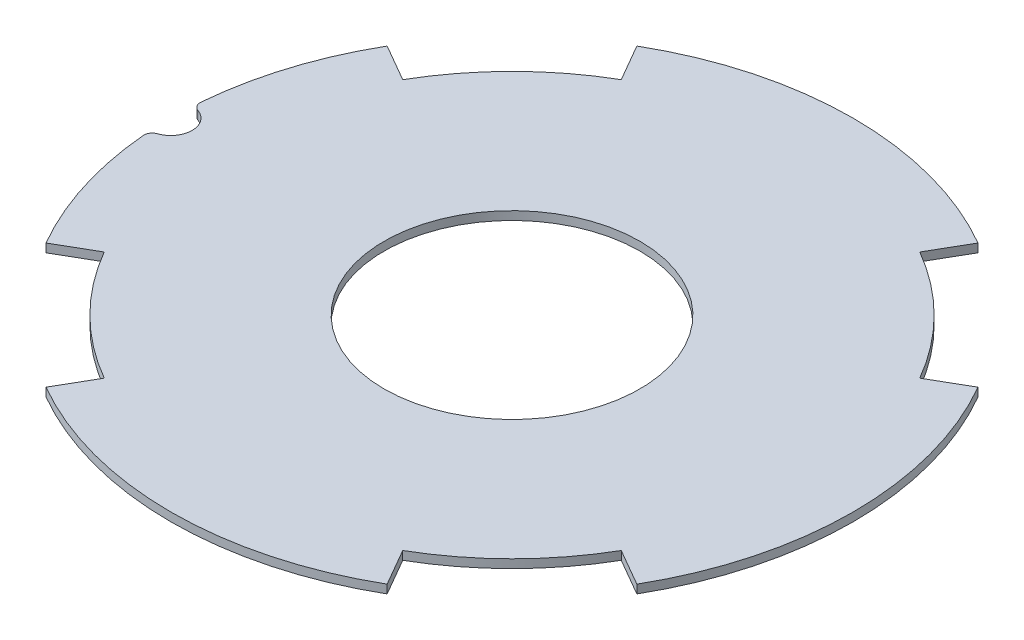
ISO-10303-21;
HEADER;
FILE_DESCRIPTION(('STEP AP214'),'2;1');
FILE_NAME('part.step','',(''),(''),'','','');
FILE_SCHEMA(('AUTOMOTIVE_DESIGN { 1 0 10303 214 1 1 1 1 }'));
ENDSEC;
DATA;
#1=APPLICATION_CONTEXT('core data for automotive mechanical design processes');
#2=APPLICATION_PROTOCOL_DEFINITION('international standard','automotive_design',2000,#1);
#3=PRODUCT_CONTEXT('',#1,'mechanical');
#4=PRODUCT('Part','Part','',(#3));
#5=PRODUCT_RELATED_PRODUCT_CATEGORY('part','',(#4));
#6=PRODUCT_DEFINITION_FORMATION('','',#4);
#7=PRODUCT_DEFINITION_CONTEXT('part definition',#1,'design');
#8=PRODUCT_DEFINITION('design','',#6,#7);
#9=PRODUCT_DEFINITION_SHAPE('','',#8);
#10=(LENGTH_UNIT() NAMED_UNIT(*) SI_UNIT(.MILLI.,.METRE.));
#11=(NAMED_UNIT(*) PLANE_ANGLE_UNIT() SI_UNIT($,.RADIAN.));
#12=(NAMED_UNIT(*) SI_UNIT($,.STERADIAN.) SOLID_ANGLE_UNIT());
#13=UNCERTAINTY_MEASURE_WITH_UNIT(LENGTH_MEASURE(1.E-05),#10,'distance_accuracy_value','');
#14=(GEOMETRIC_REPRESENTATION_CONTEXT(3) GLOBAL_UNCERTAINTY_ASSIGNED_CONTEXT((#13)) GLOBAL_UNIT_ASSIGNED_CONTEXT((#10,
#11,#12)) REPRESENTATION_CONTEXT('',''));
#15=CARTESIAN_POINT('',(0.,0.,0.));
#16=DIRECTION('',(0.,0.,1.));
#17=DIRECTION('',(1.,0.,0.));
#18=AXIS2_PLACEMENT_3D('',#15,#16,#17);
#19=CARTESIAN_POINT('',(-38.859375,1.,-3.3089234819462));
#20=DIRECTION('',(0.,-1.,0.));
#21=DIRECTION('',(0.,0.,-1.));
#22=AXIS2_PLACEMENT_3D('',#19,#20,#21);
#23=PLANE('',#22);
#24=CARTESIAN_POINT('',(-38.859375,1.,-3.3089234819462));
#25=DIRECTION('',(0.,1.,0.));
#26=DIRECTION('',(0.,0.,-1.));
#27=AXIS2_PLACEMENT_3D('',#24,#25,#26);
#28=CIRCLE('',#27,0.999999999999999);
#29=CARTESIAN_POINT('',(-39.8557692307692,1.,-3.39376767379098));
#30=VERTEX_POINT('',#29);
#31=CARTESIAN_POINT('',(-39.1852678571429,1.,-2.36351677281871));
#32=VERTEX_POINT('',#31);
#33=EDGE_CURVE('E241',#30,#32,#28,.T.);
#34=ORIENTED_EDGE('',*,*,#33,.T.);
#35=CARTESIAN_POINT('',(-40.,1.,0.));
#36=DIRECTION('',(0.,-1.,0.));
#37=DIRECTION('',(0.,0.,1.));
#38=AXIS2_PLACEMENT_3D('',#35,#36,#37);
#39=CIRCLE('',#38,2.49999999999999);
#40=CARTESIAN_POINT('',(-39.1852678571429,1.,2.36351677281871));
#41=VERTEX_POINT('',#40);
#42=EDGE_CURVE('E129',#32,#41,#39,.T.);
#43=ORIENTED_EDGE('',*,*,#42,.T.);
#44=CARTESIAN_POINT('',(-38.859375,1.,3.3089234819462));
#45=DIRECTION('',(0.,1.,0.));
#46=DIRECTION('',(0.,0.,-1.));
#47=AXIS2_PLACEMENT_3D('',#44,#45,#46);
#48=CIRCLE('',#47,0.999999999999999);
#49=CARTESIAN_POINT('',(-39.8557692307692,1.,3.39376767379097));
#50=VERTEX_POINT('',#49);
#51=EDGE_CURVE('E292',#41,#50,#48,.T.);
#52=ORIENTED_EDGE('',*,*,#51,.T.);
#53=CARTESIAN_POINT('',(0.,1.,0.));
#54=DIRECTION('',(0.,1.,0.));
#55=DIRECTION('',(0.,0.,1.));
#56=AXIS2_PLACEMENT_3D('',#53,#54,#55);
#57=CIRCLE('',#56,40.);
#58=CARTESIAN_POINT('',(-34.6410161513775,1.,20.));
#59=VERTEX_POINT('',#58);
#60=EDGE_CURVE('E311',#50,#59,#57,.T.);
#61=ORIENTED_EDGE('',*,*,#60,.T.);
#62=DIRECTION('',(0.866025403784438,0.,-0.500000000000001));
#63=VECTOR('',#62,1.);
#64=CARTESIAN_POINT('',(-34.6410161513775,1.,20.));
#65=LINE('',#64,#63);
#66=CARTESIAN_POINT('',(-30.3108891324553,1.,17.5));
#67=VERTEX_POINT('',#66);
#68=EDGE_CURVE('E308',#59,#67,#65,.T.);
#69=ORIENTED_EDGE('',*,*,#68,.T.);
#70=CARTESIAN_POINT('',(0.,1.,0.));
#71=DIRECTION('',(0.,1.,0.));
#72=DIRECTION('',(0.,0.,1.));
#73=AXIS2_PLACEMENT_3D('',#70,#71,#72);
#74=CIRCLE('',#73,35.);
#75=CARTESIAN_POINT('',(-17.4999999999999,1.,30.3108891324554));
#76=VERTEX_POINT('',#75);
#77=EDGE_CURVE('E310',#67,#76,#74,.T.);
#78=ORIENTED_EDGE('',*,*,#77,.T.);
#79=DIRECTION('',(-0.499999999999997,0.,0.86602540378444));
#80=VECTOR('',#79,1.);
#81=CARTESIAN_POINT('',(-19.9999999999999,1.,34.6410161513776));
#82=LINE('',#81,#80);
#83=CARTESIAN_POINT('',(-19.9999999999999,1.,34.6410161513776));
#84=VERTEX_POINT('',#83);
#85=EDGE_CURVE('E313',#76,#84,#82,.T.);
#86=ORIENTED_EDGE('',*,*,#85,.T.);
#87=CARTESIAN_POINT('',(0.,1.,0.));
#88=DIRECTION('',(0.,1.,0.));
#89=DIRECTION('',(0.,0.,1.));
#90=AXIS2_PLACEMENT_3D('',#87,#88,#89);
#91=CIRCLE('',#90,40.);
#92=CARTESIAN_POINT('',(19.9999999999999,1.,34.6410161513776));
#93=VERTEX_POINT('',#92);
#94=EDGE_CURVE('E319',#84,#93,#91,.T.);
#95=ORIENTED_EDGE('',*,*,#94,.T.);
#96=DIRECTION('',(-0.499999999999998,0.,-0.86602540378444));
#97=VECTOR('',#96,1.);
#98=CARTESIAN_POINT('',(17.4999999999999,1.,30.3108891324554));
#99=LINE('',#98,#97);
#100=CARTESIAN_POINT('',(17.4999999999999,1.,30.3108891324554));
#101=VERTEX_POINT('',#100);
#102=EDGE_CURVE('E321',#93,#101,#99,.T.);
#103=ORIENTED_EDGE('',*,*,#102,.T.);
#104=CARTESIAN_POINT('',(0.,1.,0.));
#105=DIRECTION('',(0.,1.,0.));
#106=DIRECTION('',(0.,0.,1.));
#107=AXIS2_PLACEMENT_3D('',#104,#105,#106);
#108=CIRCLE('',#107,35.);
#109=CARTESIAN_POINT('',(30.3108891324555,1.,17.4999999999998));
#110=VERTEX_POINT('',#109);
#111=EDGE_CURVE('E323',#101,#110,#108,.T.);
#112=ORIENTED_EDGE('',*,*,#111,.T.);
#113=DIRECTION('',(0.866025403784442,0.,0.499999999999995));
#114=VECTOR('',#113,1.);
#115=CARTESIAN_POINT('',(34.6410161513777,1.,19.9999999999998));
#116=LINE('',#115,#114);
#117=CARTESIAN_POINT('',(34.6410161513777,1.,19.9999999999998));
#118=VERTEX_POINT('',#117);
#119=EDGE_CURVE('E325',#110,#118,#116,.T.);
#120=ORIENTED_EDGE('',*,*,#119,.T.);
#121=CARTESIAN_POINT('',(0.,1.,0.));
#122=DIRECTION('',(0.,1.,0.));
#123=DIRECTION('',(0.,0.,1.));
#124=AXIS2_PLACEMENT_3D('',#121,#122,#123);
#125=CIRCLE('',#124,40.);
#126=CARTESIAN_POINT('',(34.6410161513775,1.,-20.0000000000001));
#127=VERTEX_POINT('',#126);
#128=EDGE_CURVE('E327',#118,#127,#125,.T.);
#129=ORIENTED_EDGE('',*,*,#128,.T.);
#130=DIRECTION('',(-0.866025403784438,0.,0.500000000000001));
#131=VECTOR('',#130,1.);
#132=CARTESIAN_POINT('',(30.3108891324553,1.,-17.5000000000001));
#133=LINE('',#132,#131);
#134=CARTESIAN_POINT('',(30.3108891324553,1.,-17.5000000000001));
#135=VERTEX_POINT('',#134);
#136=EDGE_CURVE('E329',#127,#135,#133,.T.);
#137=ORIENTED_EDGE('',*,*,#136,.T.);
#138=CARTESIAN_POINT('',(0.,1.,0.));
#139=DIRECTION('',(0.,1.,0.));
#140=DIRECTION('',(0.,0.,1.));
#141=AXIS2_PLACEMENT_3D('',#138,#139,#140);
#142=CIRCLE('',#141,35.);
#143=CARTESIAN_POINT('',(17.4999999999999,1.,-30.3108891324554));
#144=VERTEX_POINT('',#143);
#145=EDGE_CURVE('E331',#135,#144,#142,.T.);
#146=ORIENTED_EDGE('',*,*,#145,.T.);
#147=DIRECTION('',(0.499999999999997,0.,-0.86602540378444));
#148=VECTOR('',#147,1.);
#149=CARTESIAN_POINT('',(17.4999999999999,1.,-30.3108891324554));
#150=LINE('',#149,#148);
#151=CARTESIAN_POINT('',(19.9999999999999,1.,-34.6410161513776));
#152=VERTEX_POINT('',#151);
#153=EDGE_CURVE('E333',#144,#152,#150,.T.);
#154=ORIENTED_EDGE('',*,*,#153,.T.);
#155=CARTESIAN_POINT('',(0.,1.,0.));
#156=DIRECTION('',(0.,1.,0.));
#157=DIRECTION('',(0.,0.,1.));
#158=AXIS2_PLACEMENT_3D('',#155,#156,#157);
#159=CIRCLE('',#158,40.);
#160=CARTESIAN_POINT('',(-19.9999999999999,1.,-34.6410161513776));
#161=VERTEX_POINT('',#160);
#162=EDGE_CURVE('E335',#152,#161,#159,.T.);
#163=ORIENTED_EDGE('',*,*,#162,.T.);
#164=DIRECTION('',(0.499999999999998,0.,0.86602540378444));
#165=VECTOR('',#164,1.);
#166=CARTESIAN_POINT('',(-19.9999999999999,1.,-34.6410161513776));
#167=LINE('',#166,#165);
#168=CARTESIAN_POINT('',(-17.4999999999999,1.,-30.3108891324554));
#169=VERTEX_POINT('',#168);
#170=EDGE_CURVE('E184',#161,#169,#167,.T.);
#171=ORIENTED_EDGE('',*,*,#170,.T.);
#172=CARTESIAN_POINT('',(0.,1.,0.));
#173=DIRECTION('',(0.,1.,0.));
#174=DIRECTION('',(0.,0.,1.));
#175=AXIS2_PLACEMENT_3D('',#172,#173,#174);
#176=CIRCLE('',#175,35.);
#177=CARTESIAN_POINT('',(-30.3108891324555,1.,-17.4999999999998));
#178=VERTEX_POINT('',#177);
#179=EDGE_CURVE('E178',#169,#178,#176,.T.);
#180=ORIENTED_EDGE('',*,*,#179,.T.);
#181=DIRECTION('',(-0.866025403784442,0.,-0.499999999999995));
#182=VECTOR('',#181,1.);
#183=CARTESIAN_POINT('',(-30.3108891324555,1.,-17.4999999999998));
#184=LINE('',#183,#182);
#185=CARTESIAN_POINT('',(-34.6410161513777,1.,-19.9999999999998));
#186=VERTEX_POINT('',#185);
#187=EDGE_CURVE('E182',#178,#186,#184,.T.);
#188=ORIENTED_EDGE('',*,*,#187,.T.);
#189=CARTESIAN_POINT('',(0.,1.,0.));
#190=DIRECTION('',(0.,1.,0.));
#191=DIRECTION('',(0.,0.,1.));
#192=AXIS2_PLACEMENT_3D('',#189,#190,#191);
#193=CIRCLE('',#192,40.);
#194=EDGE_CURVE('E50',#186,#30,#193,.T.);
#195=ORIENTED_EDGE('',*,*,#194,.T.);
#196=EDGE_LOOP('',(#34,#43,#52,#61,#69,#78,#86,#95,#103,#112,#120,#129,#137,#146,#154,#163,#171,
#180,#188,#195));
#197=FACE_BOUND('',#196,.T.);
#198=CARTESIAN_POINT('',(0.,1.,0.));
#199=DIRECTION('',(0.,1.,0.));
#200=DIRECTION('',(0.,0.,1.));
#201=AXIS2_PLACEMENT_3D('',#198,#199,#200);
#202=CIRCLE('',#201,15.);
#203=CARTESIAN_POINT('',(0.,1.,15.));
#204=VERTEX_POINT('',#203);
#205=EDGE_CURVE('E206',#204,#204,#202,.T.);
#206=ORIENTED_EDGE('',*,*,#205,.F.);
#207=EDGE_LOOP('',(#206));
#208=FACE_BOUND('',#207,.T.);
#209=ADVANCED_FACE('F33',(#197,#208),#23,.F.);
#210=CARTESIAN_POINT('',(-38.859375,0.,-3.3089234819462));
#211=DIRECTION('',(0.,-1.,0.));
#212=DIRECTION('',(0.,0.,-1.));
#213=AXIS2_PLACEMENT_3D('',#210,#211,#212);
#214=PLANE('',#213);
#215=CARTESIAN_POINT('',(-38.859375,0.,-3.3089234819462));
#216=DIRECTION('',(0.,1.,0.));
#217=DIRECTION('',(0.,0.,-1.));
#218=AXIS2_PLACEMENT_3D('',#215,#216,#217);
#219=CIRCLE('',#218,0.999999999999999);
#220=CARTESIAN_POINT('',(-39.8557692307692,0.,-3.39376767379098));
#221=VERTEX_POINT('',#220);
#222=CARTESIAN_POINT('',(-39.1852678571429,0.,-2.36351677281871));
#223=VERTEX_POINT('',#222);
#224=EDGE_CURVE('E202',#221,#223,#219,.T.);
#225=ORIENTED_EDGE('',*,*,#224,.F.);
#226=CARTESIAN_POINT('',(0.,0.,0.));
#227=DIRECTION('',(0.,1.,0.));
#228=DIRECTION('',(0.,0.,1.));
#229=AXIS2_PLACEMENT_3D('',#226,#227,#228);
#230=CIRCLE('',#229,40.);
#231=CARTESIAN_POINT('',(-34.6410161513777,0.,-19.9999999999998));
#232=VERTEX_POINT('',#231);
#233=EDGE_CURVE('E121',#232,#221,#230,.T.);
#234=ORIENTED_EDGE('',*,*,#233,.F.);
#235=DIRECTION('',(-0.866025403784442,0.,-0.499999999999995));
#236=VECTOR('',#235,1.);
#237=CARTESIAN_POINT('',(-30.3108891324555,0.,-17.4999999999998));
#238=LINE('',#237,#236);
#239=CARTESIAN_POINT('',(-30.3108891324555,0.,-17.4999999999998));
#240=VERTEX_POINT('',#239);
#241=EDGE_CURVE('E115',#240,#232,#238,.T.);
#242=ORIENTED_EDGE('',*,*,#241,.F.);
#243=CARTESIAN_POINT('',(0.,0.,0.));
#244=DIRECTION('',(0.,1.,0.));
#245=DIRECTION('',(0.,0.,1.));
#246=AXIS2_PLACEMENT_3D('',#243,#244,#245);
#247=CIRCLE('',#246,35.);
#248=CARTESIAN_POINT('',(-17.4999999999999,0.,-30.3108891324554));
#249=VERTEX_POINT('',#248);
#250=EDGE_CURVE('E192',#249,#240,#247,.T.);
#251=ORIENTED_EDGE('',*,*,#250,.F.);
#252=DIRECTION('',(0.499999999999998,0.,0.86602540378444));
#253=VECTOR('',#252,1.);
#254=CARTESIAN_POINT('',(-19.9999999999999,0.,-34.6410161513776));
#255=LINE('',#254,#253);
#256=CARTESIAN_POINT('',(-19.9999999999999,0.,-34.6410161513776));
#257=VERTEX_POINT('',#256);
#258=EDGE_CURVE('E236',#257,#249,#255,.T.);
#259=ORIENTED_EDGE('',*,*,#258,.F.);
#260=CARTESIAN_POINT('',(0.,0.,0.));
#261=DIRECTION('',(0.,1.,0.));
#262=DIRECTION('',(0.,0.,1.));
#263=AXIS2_PLACEMENT_3D('',#260,#261,#262);
#264=CIRCLE('',#263,40.);
#265=CARTESIAN_POINT('',(19.9999999999999,0.,-34.6410161513776));
#266=VERTEX_POINT('',#265);
#267=EDGE_CURVE('E234',#266,#257,#264,.T.);
#268=ORIENTED_EDGE('',*,*,#267,.F.);
#269=DIRECTION('',(0.499999999999997,0.,-0.86602540378444));
#270=VECTOR('',#269,1.);
#271=CARTESIAN_POINT('',(17.4999999999999,0.,-30.3108891324554));
#272=LINE('',#271,#270);
#273=CARTESIAN_POINT('',(17.4999999999999,0.,-30.3108891324554));
#274=VERTEX_POINT('',#273);
#275=EDGE_CURVE('E232',#274,#266,#272,.T.);
#276=ORIENTED_EDGE('',*,*,#275,.F.);
#277=CARTESIAN_POINT('',(0.,0.,0.));
#278=DIRECTION('',(0.,1.,0.));
#279=DIRECTION('',(0.,0.,1.));
#280=AXIS2_PLACEMENT_3D('',#277,#278,#279);
#281=CIRCLE('',#280,35.);
#282=CARTESIAN_POINT('',(30.3108891324553,0.,-17.5000000000001));
#283=VERTEX_POINT('',#282);
#284=EDGE_CURVE('E230',#283,#274,#281,.T.);
#285=ORIENTED_EDGE('',*,*,#284,.F.);
#286=DIRECTION('',(-0.866025403784438,0.,0.500000000000001));
#287=VECTOR('',#286,1.);
#288=CARTESIAN_POINT('',(30.3108891324553,0.,-17.5000000000001));
#289=LINE('',#288,#287);
#290=CARTESIAN_POINT('',(34.6410161513775,0.,-20.0000000000001));
#291=VERTEX_POINT('',#290);
#292=EDGE_CURVE('E228',#291,#283,#289,.T.);
#293=ORIENTED_EDGE('',*,*,#292,.F.);
#294=CARTESIAN_POINT('',(0.,0.,0.));
#295=DIRECTION('',(0.,1.,0.));
#296=DIRECTION('',(0.,0.,1.));
#297=AXIS2_PLACEMENT_3D('',#294,#295,#296);
#298=CIRCLE('',#297,40.);
#299=CARTESIAN_POINT('',(34.6410161513777,0.,19.9999999999998));
#300=VERTEX_POINT('',#299);
#301=EDGE_CURVE('E226',#300,#291,#298,.T.);
#302=ORIENTED_EDGE('',*,*,#301,.F.);
#303=DIRECTION('',(0.866025403784442,0.,0.499999999999995));
#304=VECTOR('',#303,1.);
#305=CARTESIAN_POINT('',(34.6410161513777,0.,19.9999999999998));
#306=LINE('',#305,#304);
#307=CARTESIAN_POINT('',(30.3108891324555,0.,17.4999999999998));
#308=VERTEX_POINT('',#307);
#309=EDGE_CURVE('E224',#308,#300,#306,.T.);
#310=ORIENTED_EDGE('',*,*,#309,.F.);
#311=CARTESIAN_POINT('',(0.,0.,0.));
#312=DIRECTION('',(0.,1.,0.));
#313=DIRECTION('',(0.,0.,1.));
#314=AXIS2_PLACEMENT_3D('',#311,#312,#313);
#315=CIRCLE('',#314,35.);
#316=CARTESIAN_POINT('',(17.4999999999999,0.,30.3108891324554));
#317=VERTEX_POINT('',#316);
#318=EDGE_CURVE('E222',#317,#308,#315,.T.);
#319=ORIENTED_EDGE('',*,*,#318,.F.);
#320=DIRECTION('',(-0.499999999999998,0.,-0.86602540378444));
#321=VECTOR('',#320,1.);
#322=CARTESIAN_POINT('',(17.4999999999999,0.,30.3108891324554));
#323=LINE('',#322,#321);
#324=CARTESIAN_POINT('',(19.9999999999999,0.,34.6410161513776));
#325=VERTEX_POINT('',#324);
#326=EDGE_CURVE('E220',#325,#317,#323,.T.);
#327=ORIENTED_EDGE('',*,*,#326,.F.);
#328=CARTESIAN_POINT('',(0.,0.,0.));
#329=DIRECTION('',(0.,1.,0.));
#330=DIRECTION('',(0.,0.,1.));
#331=AXIS2_PLACEMENT_3D('',#328,#329,#330);
#332=CIRCLE('',#331,40.);
#333=CARTESIAN_POINT('',(-19.9999999999999,0.,34.6410161513776));
#334=VERTEX_POINT('',#333);
#335=EDGE_CURVE('E218',#334,#325,#332,.T.);
#336=ORIENTED_EDGE('',*,*,#335,.F.);
#337=DIRECTION('',(-0.499999999999997,0.,0.86602540378444));
#338=VECTOR('',#337,1.);
#339=CARTESIAN_POINT('',(-19.9999999999999,0.,34.6410161513776));
#340=LINE('',#339,#338);
#341=CARTESIAN_POINT('',(-17.4999999999999,0.,30.3108891324554));
#342=VERTEX_POINT('',#341);
#343=EDGE_CURVE('E216',#342,#334,#340,.T.);
#344=ORIENTED_EDGE('',*,*,#343,.F.);
#345=CARTESIAN_POINT('',(0.,0.,0.));
#346=DIRECTION('',(0.,1.,0.));
#347=DIRECTION('',(0.,0.,1.));
#348=AXIS2_PLACEMENT_3D('',#345,#346,#347);
#349=CIRCLE('',#348,35.);
#350=CARTESIAN_POINT('',(-30.3108891324553,0.,17.5));
#351=VERTEX_POINT('',#350);
#352=EDGE_CURVE('E214',#351,#342,#349,.T.);
#353=ORIENTED_EDGE('',*,*,#352,.F.);
#354=DIRECTION('',(0.866025403784438,0.,-0.500000000000001));
#355=VECTOR('',#354,1.);
#356=CARTESIAN_POINT('',(-34.6410161513775,0.,20.));
#357=LINE('',#356,#355);
#358=CARTESIAN_POINT('',(-34.6410161513775,0.,20.));
#359=VERTEX_POINT('',#358);
#360=EDGE_CURVE('E212',#359,#351,#357,.T.);
#361=ORIENTED_EDGE('',*,*,#360,.F.);
#362=CARTESIAN_POINT('',(0.,0.,0.));
#363=DIRECTION('',(0.,1.,0.));
#364=DIRECTION('',(0.,0.,1.));
#365=AXIS2_PLACEMENT_3D('',#362,#363,#364);
#366=CIRCLE('',#365,40.);
#367=CARTESIAN_POINT('',(-39.8557692307692,0.,3.39376767379097));
#368=VERTEX_POINT('',#367);
#369=EDGE_CURVE('E210',#368,#359,#366,.T.);
#370=ORIENTED_EDGE('',*,*,#369,.F.);
#371=CARTESIAN_POINT('',(-38.859375,0.,3.3089234819462));
#372=DIRECTION('',(0.,1.,0.));
#373=DIRECTION('',(0.,0.,-1.));
#374=AXIS2_PLACEMENT_3D('',#371,#372,#373);
#375=CIRCLE('',#374,0.999999999999999);
#376=CARTESIAN_POINT('',(-39.1852678571429,0.,2.36351677281871));
#377=VERTEX_POINT('',#376);
#378=EDGE_CURVE('E208',#377,#368,#375,.T.);
#379=ORIENTED_EDGE('',*,*,#378,.F.);
#380=CARTESIAN_POINT('',(-40.,0.,0.));
#381=DIRECTION('',(0.,-1.,0.));
#382=DIRECTION('',(0.,0.,1.));
#383=AXIS2_PLACEMENT_3D('',#380,#381,#382);
#384=CIRCLE('',#383,2.49999999999999);
#385=EDGE_CURVE('E205',#223,#377,#384,.T.);
#386=ORIENTED_EDGE('',*,*,#385,.F.);
#387=EDGE_LOOP('',(#225,#234,#242,#251,#259,#268,#276,#285,#293,#302,#310,#319,#327,#336,#344,
#353,#361,#370,#379,#386));
#388=FACE_BOUND('',#387,.T.);
#389=CARTESIAN_POINT('',(0.,0.,0.));
#390=DIRECTION('',(0.,1.,0.));
#391=DIRECTION('',(0.,0.,1.));
#392=AXIS2_PLACEMENT_3D('',#389,#390,#391);
#393=CIRCLE('',#392,15.);
#394=CARTESIAN_POINT('',(0.,0.,15.));
#395=VERTEX_POINT('',#394);
#396=EDGE_CURVE('E586',#395,#395,#393,.T.);
#397=ORIENTED_EDGE('',*,*,#396,.T.);
#398=EDGE_LOOP('',(#397));
#399=FACE_BOUND('',#398,.T.);
#400=ADVANCED_FACE('F296',(#388,#399),#214,.T.);
#401=CARTESIAN_POINT('',(-38.859375,1.,-3.3089234819462));
#402=DIRECTION('',(0.,-1.,0.));
#403=DIRECTION('',(0.,0.,-1.));
#404=AXIS2_PLACEMENT_3D('',#401,#402,#403);
#405=CYLINDRICAL_SURFACE('',#404,0.999999999999999);
#406=ORIENTED_EDGE('',*,*,#224,.T.);
#407=DIRECTION('',(0.,-1.,0.));
#408=VECTOR('',#407,1.);
#409=CARTESIAN_POINT('',(-39.1852678571429,1.,-2.36351677281871));
#410=LINE('',#409,#408);
#411=EDGE_CURVE('E11',#32,#223,#410,.T.);
#412=ORIENTED_EDGE('',*,*,#411,.F.);
#413=ORIENTED_EDGE('',*,*,#33,.F.);
#414=DIRECTION('',(0.,-1.,0.));
#415=VECTOR('',#414,1.);
#416=CARTESIAN_POINT('',(-39.8557692307692,1.,-3.39376767379098));
#417=LINE('',#416,#415);
#418=EDGE_CURVE('E198',#30,#221,#417,.T.);
#419=ORIENTED_EDGE('',*,*,#418,.T.);
#420=EDGE_LOOP('',(#406,#412,#413,#419));
#421=FACE_BOUND('',#420,.T.);
#422=ADVANCED_FACE('F35',(#421),#405,.T.);
#423=CARTESIAN_POINT('',(-40.,1.,0.));
#424=DIRECTION('',(0.,-1.,0.));
#425=DIRECTION('',(0.,0.,-1.));
#426=AXIS2_PLACEMENT_3D('',#423,#424,#425);
#427=CYLINDRICAL_SURFACE('',#426,2.49999999999999);
#428=ORIENTED_EDGE('',*,*,#385,.T.);
#429=DIRECTION('',(0.,-1.,0.));
#430=VECTOR('',#429,1.);
#431=CARTESIAN_POINT('',(-39.1852678571429,1.,2.36351677281871));
#432=LINE('',#431,#430);
#433=EDGE_CURVE('E42',#41,#377,#432,.T.);
#434=ORIENTED_EDGE('',*,*,#433,.F.);
#435=ORIENTED_EDGE('',*,*,#42,.F.);
#436=ORIENTED_EDGE('',*,*,#411,.T.);
#437=EDGE_LOOP('',(#428,#434,#435,#436));
#438=FACE_BOUND('',#437,.T.);
#439=ADVANCED_FACE('F369',(#438),#427,.F.);
#440=CARTESIAN_POINT('',(-38.859375,1.,3.3089234819462));
#441=DIRECTION('',(0.,-1.,0.));
#442=DIRECTION('',(0.,0.,-1.));
#443=AXIS2_PLACEMENT_3D('',#440,#441,#442);
#444=CYLINDRICAL_SURFACE('',#443,0.999999999999999);
#445=ORIENTED_EDGE('',*,*,#378,.T.);
#446=DIRECTION('',(0.,-1.,0.));
#447=VECTOR('',#446,1.);
#448=CARTESIAN_POINT('',(-39.8557692307692,1.,3.39376767379097));
#449=LINE('',#448,#447);
#450=EDGE_CURVE('E284',#50,#368,#449,.T.);
#451=ORIENTED_EDGE('',*,*,#450,.F.);
#452=ORIENTED_EDGE('',*,*,#51,.F.);
#453=ORIENTED_EDGE('',*,*,#433,.T.);
#454=EDGE_LOOP('',(#445,#451,#452,#453));
#455=FACE_BOUND('',#454,.T.);
#456=ADVANCED_FACE('F290',(#455),#444,.T.);
#457=CARTESIAN_POINT('',(0.,1.,0.));
#458=DIRECTION('',(0.,-1.,0.));
#459=DIRECTION('',(0.,0.,-1.));
#460=AXIS2_PLACEMENT_3D('',#457,#458,#459);
#461=CYLINDRICAL_SURFACE('',#460,40.);
#462=ORIENTED_EDGE('',*,*,#369,.T.);
#463=DIRECTION('',(0.,-1.,0.));
#464=VECTOR('',#463,1.);
#465=CARTESIAN_POINT('',(-34.6410161513775,1.,20.));
#466=LINE('',#465,#464);
#467=EDGE_CURVE('E281',#59,#359,#466,.T.);
#468=ORIENTED_EDGE('',*,*,#467,.F.);
#469=ORIENTED_EDGE('',*,*,#60,.F.);
#470=ORIENTED_EDGE('',*,*,#450,.T.);
#471=EDGE_LOOP('',(#462,#468,#469,#470));
#472=FACE_BOUND('',#471,.T.);
#473=ADVANCED_FACE('F302',(#472),#461,.T.);
#474=CARTESIAN_POINT('',(-34.6410161513775,1.,20.));
#475=DIRECTION('',(-0.500000000000002,0.,-0.866025403784438));
#476=DIRECTION('',(-0.866025403784438,0.,0.500000000000001));
#477=AXIS2_PLACEMENT_3D('',#474,#475,#476);
#478=PLANE('',#477);
#479=ORIENTED_EDGE('',*,*,#360,.T.);
#480=DIRECTION('',(0.,-1.,0.));
#481=VECTOR('',#480,1.);
#482=CARTESIAN_POINT('',(-30.3108891324553,1.,17.5));
#483=LINE('',#482,#481);
#484=EDGE_CURVE('E278',#67,#351,#483,.T.);
#485=ORIENTED_EDGE('',*,*,#484,.F.);
#486=ORIENTED_EDGE('',*,*,#68,.F.);
#487=ORIENTED_EDGE('',*,*,#467,.T.);
#488=EDGE_LOOP('',(#479,#485,#486,#487));
#489=FACE_BOUND('',#488,.T.);
#490=ADVANCED_FACE('F306',(#489),#478,.F.);
#491=CARTESIAN_POINT('',(0.,1.,0.));
#492=DIRECTION('',(0.,-1.,0.));
#493=DIRECTION('',(0.,0.,-1.));
#494=AXIS2_PLACEMENT_3D('',#491,#492,#493);
#495=CYLINDRICAL_SURFACE('',#494,35.);
#496=ORIENTED_EDGE('',*,*,#352,.T.);
#497=DIRECTION('',(0.,-1.,0.));
#498=VECTOR('',#497,1.);
#499=CARTESIAN_POINT('',(-17.4999999999999,1.,30.3108891324554));
#500=LINE('',#499,#498);
#501=EDGE_CURVE('E275',#76,#342,#500,.T.);
#502=ORIENTED_EDGE('',*,*,#501,.F.);
#503=ORIENTED_EDGE('',*,*,#77,.F.);
#504=ORIENTED_EDGE('',*,*,#484,.T.);
#505=EDGE_LOOP('',(#496,#502,#503,#504));
#506=FACE_BOUND('',#505,.T.);
#507=ADVANCED_FACE('F382',(#506),#495,.T.);
#508=CARTESIAN_POINT('',(-19.9999999999999,1.,34.6410161513776));
#509=DIRECTION('',(0.86602540378444,0.,0.499999999999997));
#510=DIRECTION('',(0.499999999999997,0.,-0.86602540378444));
#511=AXIS2_PLACEMENT_3D('',#508,#509,#510);
#512=PLANE('',#511);
#513=ORIENTED_EDGE('',*,*,#343,.T.);
#514=DIRECTION('',(0.,-1.,0.));
#515=VECTOR('',#514,1.);
#516=CARTESIAN_POINT('',(-19.9999999999999,1.,34.6410161513776));
#517=LINE('',#516,#515);
#518=EDGE_CURVE('E272',#84,#334,#517,.T.);
#519=ORIENTED_EDGE('',*,*,#518,.F.);
#520=ORIENTED_EDGE('',*,*,#85,.F.);
#521=ORIENTED_EDGE('',*,*,#501,.T.);
#522=EDGE_LOOP('',(#513,#519,#520,#521));
#523=FACE_BOUND('',#522,.T.);
#524=ADVANCED_FACE('F385',(#523),#512,.F.);
#525=CARTESIAN_POINT('',(0.,1.,0.));
#526=DIRECTION('',(0.,-1.,0.));
#527=DIRECTION('',(0.,0.,-1.));
#528=AXIS2_PLACEMENT_3D('',#525,#526,#527);
#529=CYLINDRICAL_SURFACE('',#528,40.);
#530=ORIENTED_EDGE('',*,*,#335,.T.);
#531=DIRECTION('',(0.,-1.,0.));
#532=VECTOR('',#531,1.);
#533=CARTESIAN_POINT('',(19.9999999999999,1.,34.6410161513776));
#534=LINE('',#533,#532);
#535=EDGE_CURVE('E269',#93,#325,#534,.T.);
#536=ORIENTED_EDGE('',*,*,#535,.F.);
#537=ORIENTED_EDGE('',*,*,#94,.F.);
#538=ORIENTED_EDGE('',*,*,#518,.T.);
#539=EDGE_LOOP('',(#530,#536,#537,#538));
#540=FACE_BOUND('',#539,.T.);
#541=ADVANCED_FACE('F389',(#540),#529,.T.);
#542=CARTESIAN_POINT('',(17.4999999999999,1.,30.3108891324554));
#543=DIRECTION('',(-0.86602540378444,0.,0.499999999999998));
#544=DIRECTION('',(0.499999999999998,0.,0.86602540378444));
#545=AXIS2_PLACEMENT_3D('',#542,#543,#544);
#546=PLANE('',#545);
#547=ORIENTED_EDGE('',*,*,#326,.T.);
#548=DIRECTION('',(0.,-1.,0.));
#549=VECTOR('',#548,1.);
#550=CARTESIAN_POINT('',(17.4999999999999,1.,30.3108891324554));
#551=LINE('',#550,#549);
#552=EDGE_CURVE('E266',#101,#317,#551,.T.);
#553=ORIENTED_EDGE('',*,*,#552,.F.);
#554=ORIENTED_EDGE('',*,*,#102,.F.);
#555=ORIENTED_EDGE('',*,*,#535,.T.);
#556=EDGE_LOOP('',(#547,#553,#554,#555));
#557=FACE_BOUND('',#556,.T.);
#558=ADVANCED_FACE('F393',(#557),#546,.F.);
#559=CARTESIAN_POINT('',(0.,1.,0.));
#560=DIRECTION('',(0.,-1.,0.));
#561=DIRECTION('',(0.,0.,-1.));
#562=AXIS2_PLACEMENT_3D('',#559,#560,#561);
#563=CYLINDRICAL_SURFACE('',#562,35.);
#564=ORIENTED_EDGE('',*,*,#318,.T.);
#565=DIRECTION('',(0.,-1.,0.));
#566=VECTOR('',#565,1.);
#567=CARTESIAN_POINT('',(30.3108891324555,1.,17.4999999999998));
#568=LINE('',#567,#566);
#569=EDGE_CURVE('E263',#110,#308,#568,.T.);
#570=ORIENTED_EDGE('',*,*,#569,.F.);
#571=ORIENTED_EDGE('',*,*,#111,.F.);
#572=ORIENTED_EDGE('',*,*,#552,.T.);
#573=EDGE_LOOP('',(#564,#570,#571,#572));
#574=FACE_BOUND('',#573,.T.);
#575=ADVANCED_FACE('F397',(#574),#563,.T.);
#576=CARTESIAN_POINT('',(34.6410161513777,1.,19.9999999999998));
#577=DIRECTION('',(0.499999999999995,0.,-0.866025403784442));
#578=DIRECTION('',(-0.866025403784442,0.,-0.499999999999995));
#579=AXIS2_PLACEMENT_3D('',#576,#577,#578);
#580=PLANE('',#579);
#581=ORIENTED_EDGE('',*,*,#309,.T.);
#582=DIRECTION('',(0.,-1.,0.));
#583=VECTOR('',#582,1.);
#584=CARTESIAN_POINT('',(34.6410161513777,1.,19.9999999999998));
#585=LINE('',#584,#583);
#586=EDGE_CURVE('E260',#118,#300,#585,.T.);
#587=ORIENTED_EDGE('',*,*,#586,.F.);
#588=ORIENTED_EDGE('',*,*,#119,.F.);
#589=ORIENTED_EDGE('',*,*,#569,.T.);
#590=EDGE_LOOP('',(#581,#587,#588,#589));
#591=FACE_BOUND('',#590,.T.);
#592=ADVANCED_FACE('F401',(#591),#580,.F.);
#593=CARTESIAN_POINT('',(0.,1.,0.));
#594=DIRECTION('',(0.,-1.,0.));
#595=DIRECTION('',(0.,0.,-1.));
#596=AXIS2_PLACEMENT_3D('',#593,#594,#595);
#597=CYLINDRICAL_SURFACE('',#596,40.);
#598=ORIENTED_EDGE('',*,*,#301,.T.);
#599=DIRECTION('',(0.,-1.,0.));
#600=VECTOR('',#599,1.);
#601=CARTESIAN_POINT('',(34.6410161513775,1.,-20.0000000000001));
#602=LINE('',#601,#600);
#603=EDGE_CURVE('E257',#127,#291,#602,.T.);
#604=ORIENTED_EDGE('',*,*,#603,.F.);
#605=ORIENTED_EDGE('',*,*,#128,.F.);
#606=ORIENTED_EDGE('',*,*,#586,.T.);
#607=EDGE_LOOP('',(#598,#604,#605,#606));
#608=FACE_BOUND('',#607,.T.);
#609=ADVANCED_FACE('F405',(#608),#597,.T.);
#610=CARTESIAN_POINT('',(30.3108891324553,1.,-17.5000000000001));
#611=DIRECTION('',(0.500000000000001,0.,0.866025403784438));
#612=DIRECTION('',(0.866025403784438,0.,-0.500000000000001));
#613=AXIS2_PLACEMENT_3D('',#610,#611,#612);
#614=PLANE('',#613);
#615=ORIENTED_EDGE('',*,*,#292,.T.);
#616=DIRECTION('',(0.,-1.,0.));
#617=VECTOR('',#616,1.);
#618=CARTESIAN_POINT('',(30.3108891324553,1.,-17.5000000000001));
#619=LINE('',#618,#617);
#620=EDGE_CURVE('E254',#135,#283,#619,.T.);
#621=ORIENTED_EDGE('',*,*,#620,.F.);
#622=ORIENTED_EDGE('',*,*,#136,.F.);
#623=ORIENTED_EDGE('',*,*,#603,.T.);
#624=EDGE_LOOP('',(#615,#621,#622,#623));
#625=FACE_BOUND('',#624,.T.);
#626=ADVANCED_FACE('F409',(#625),#614,.F.);
#627=CARTESIAN_POINT('',(0.,1.,0.));
#628=DIRECTION('',(0.,-1.,0.));
#629=DIRECTION('',(0.,0.,-1.));
#630=AXIS2_PLACEMENT_3D('',#627,#628,#629);
#631=CYLINDRICAL_SURFACE('',#630,35.);
#632=ORIENTED_EDGE('',*,*,#284,.T.);
#633=DIRECTION('',(0.,-1.,0.));
#634=VECTOR('',#633,1.);
#635=CARTESIAN_POINT('',(17.4999999999999,1.,-30.3108891324554));
#636=LINE('',#635,#634);
#637=EDGE_CURVE('E251',#144,#274,#636,.T.);
#638=ORIENTED_EDGE('',*,*,#637,.F.);
#639=ORIENTED_EDGE('',*,*,#145,.F.);
#640=ORIENTED_EDGE('',*,*,#620,.T.);
#641=EDGE_LOOP('',(#632,#638,#639,#640));
#642=FACE_BOUND('',#641,.T.);
#643=ADVANCED_FACE('F413',(#642),#631,.T.);
#644=CARTESIAN_POINT('',(17.4999999999999,1.,-30.3108891324554));
#645=DIRECTION('',(-0.86602540378444,0.,-0.499999999999997));
#646=DIRECTION('',(-0.499999999999997,0.,0.86602540378444));
#647=AXIS2_PLACEMENT_3D('',#644,#645,#646);
#648=PLANE('',#647);
#649=ORIENTED_EDGE('',*,*,#275,.T.);
#650=DIRECTION('',(0.,-1.,0.));
#651=VECTOR('',#650,1.);
#652=CARTESIAN_POINT('',(19.9999999999999,1.,-34.6410161513776));
#653=LINE('',#652,#651);
#654=EDGE_CURVE('E248',#152,#266,#653,.T.);
#655=ORIENTED_EDGE('',*,*,#654,.F.);
#656=ORIENTED_EDGE('',*,*,#153,.F.);
#657=ORIENTED_EDGE('',*,*,#637,.T.);
#658=EDGE_LOOP('',(#649,#655,#656,#657));
#659=FACE_BOUND('',#658,.T.);
#660=ADVANCED_FACE('F417',(#659),#648,.F.);
#661=CARTESIAN_POINT('',(0.,1.,0.));
#662=DIRECTION('',(0.,-1.,0.));
#663=DIRECTION('',(0.,0.,-1.));
#664=AXIS2_PLACEMENT_3D('',#661,#662,#663);
#665=CYLINDRICAL_SURFACE('',#664,40.);
#666=ORIENTED_EDGE('',*,*,#267,.T.);
#667=DIRECTION('',(0.,-1.,0.));
#668=VECTOR('',#667,1.);
#669=CARTESIAN_POINT('',(-19.9999999999999,1.,-34.6410161513776));
#670=LINE('',#669,#668);
#671=EDGE_CURVE('E245',#161,#257,#670,.T.);
#672=ORIENTED_EDGE('',*,*,#671,.F.);
#673=ORIENTED_EDGE('',*,*,#162,.F.);
#674=ORIENTED_EDGE('',*,*,#654,.T.);
#675=EDGE_LOOP('',(#666,#672,#673,#674));
#676=FACE_BOUND('',#675,.T.);
#677=ADVANCED_FACE('F341',(#676),#665,.T.);
#678=CARTESIAN_POINT('',(-19.9999999999999,1.,-34.6410161513776));
#679=DIRECTION('',(0.86602540378444,0.,-0.499999999999998));
#680=DIRECTION('',(-0.499999999999998,0.,-0.86602540378444));
#681=AXIS2_PLACEMENT_3D('',#678,#679,#680);
#682=PLANE('',#681);
#683=ORIENTED_EDGE('',*,*,#258,.T.);
#684=DIRECTION('',(0.,-1.,0.));
#685=VECTOR('',#684,1.);
#686=CARTESIAN_POINT('',(-17.4999999999999,1.,-30.3108891324554));
#687=LINE('',#686,#685);
#688=EDGE_CURVE('E193',#169,#249,#687,.T.);
#689=ORIENTED_EDGE('',*,*,#688,.F.);
#690=ORIENTED_EDGE('',*,*,#170,.F.);
#691=ORIENTED_EDGE('',*,*,#671,.T.);
#692=EDGE_LOOP('',(#683,#689,#690,#691));
#693=FACE_BOUND('',#692,.T.);
#694=ADVANCED_FACE('F345',(#693),#682,.F.);
#695=CARTESIAN_POINT('',(0.,1.,0.));
#696=DIRECTION('',(0.,-1.,0.));
#697=DIRECTION('',(0.,0.,-1.));
#698=AXIS2_PLACEMENT_3D('',#695,#696,#697);
#699=CYLINDRICAL_SURFACE('',#698,35.);
#700=ORIENTED_EDGE('',*,*,#250,.T.);
#701=DIRECTION('',(0.,-1.,0.));
#702=VECTOR('',#701,1.);
#703=CARTESIAN_POINT('',(-30.3108891324555,1.,-17.4999999999998));
#704=LINE('',#703,#702);
#705=EDGE_CURVE('E189',#178,#240,#704,.T.);
#706=ORIENTED_EDGE('',*,*,#705,.F.);
#707=ORIENTED_EDGE('',*,*,#179,.F.);
#708=ORIENTED_EDGE('',*,*,#688,.T.);
#709=EDGE_LOOP('',(#700,#706,#707,#708));
#710=FACE_BOUND('',#709,.T.);
#711=ADVANCED_FACE('F190',(#710),#699,.T.);
#712=CARTESIAN_POINT('',(-30.3108891324555,1.,-17.4999999999998));
#713=DIRECTION('',(-0.499999999999995,0.,0.866025403784442));
#714=DIRECTION('',(0.866025403784442,0.,0.499999999999995));
#715=AXIS2_PLACEMENT_3D('',#712,#713,#714);
#716=PLANE('',#715);
#717=ORIENTED_EDGE('',*,*,#241,.T.);
#718=DIRECTION('',(0.,-1.,0.));
#719=VECTOR('',#718,1.);
#720=CARTESIAN_POINT('',(-34.6410161513777,1.,-19.9999999999998));
#721=LINE('',#720,#719);
#722=EDGE_CURVE('E194',#186,#232,#721,.T.);
#723=ORIENTED_EDGE('',*,*,#722,.F.);
#724=ORIENTED_EDGE('',*,*,#187,.F.);
#725=ORIENTED_EDGE('',*,*,#705,.T.);
#726=EDGE_LOOP('',(#717,#723,#724,#725));
#727=FACE_BOUND('',#726,.T.);
#728=ADVANCED_FACE('F196',(#727),#716,.F.);
#729=CARTESIAN_POINT('',(0.,1.,0.));
#730=DIRECTION('',(0.,-1.,0.));
#731=DIRECTION('',(0.,0.,-1.));
#732=AXIS2_PLACEMENT_3D('',#729,#730,#731);
#733=CYLINDRICAL_SURFACE('',#732,40.);
#734=ORIENTED_EDGE('',*,*,#233,.T.);
#735=ORIENTED_EDGE('',*,*,#418,.F.);
#736=ORIENTED_EDGE('',*,*,#194,.F.);
#737=ORIENTED_EDGE('',*,*,#722,.T.);
#738=EDGE_LOOP('',(#734,#735,#736,#737));
#739=FACE_BOUND('',#738,.T.);
#740=ADVANCED_FACE('F349',(#739),#733,.T.);
#741=CARTESIAN_POINT('',(0.,1.,0.));
#742=DIRECTION('',(0.,-1.,0.));
#743=DIRECTION('',(0.,0.,-1.));
#744=AXIS2_PLACEMENT_3D('',#741,#742,#743);
#745=CYLINDRICAL_SURFACE('',#744,15.);
#746=ORIENTED_EDGE('',*,*,#205,.T.);
#747=EDGE_LOOP('',(#746));
#748=FACE_BOUND('',#747,.T.);
#749=ORIENTED_EDGE('',*,*,#396,.F.);
#750=EDGE_LOOP('',(#749));
#751=FACE_BOUND('',#750,.T.);
#752=ADVANCED_FACE('F351',(#748,#751),#745,.F.);
#753=CLOSED_SHELL('',(#209,#400,#422,#439,#456,#473,#490,#507,#524,#541,#558,#575,#592,#609,
#626,#643,#660,#677,#694,#711,#728,#740,#752));
#754=MANIFOLD_SOLID_BREP('B2',#753);
#755=ADVANCED_BREP_SHAPE_REPRESENTATION('',(#18,#754),#14);
#756=SHAPE_DEFINITION_REPRESENTATION(#9,#755);
ENDSEC;
END-ISO-10303-21;
